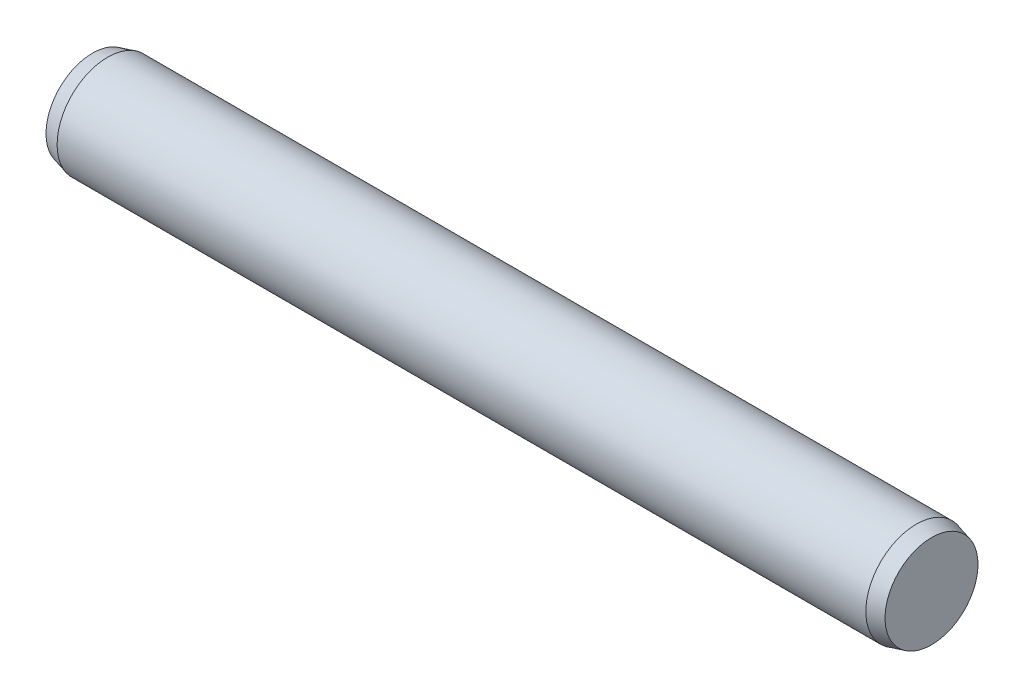
ISO-10303-21;
HEADER;
FILE_DESCRIPTION(('STEP AP214'),'2;1');
FILE_NAME('part.step','',(''),(''),'','','');
FILE_SCHEMA(('AUTOMOTIVE_DESIGN { 1 0 10303 214 1 1 1 1 }'));
ENDSEC;
DATA;
#1=APPLICATION_CONTEXT('core data for automotive mechanical design processes');
#2=APPLICATION_PROTOCOL_DEFINITION('international standard','automotive_design',2000,#1);
#3=PRODUCT_CONTEXT('',#1,'mechanical');
#4=PRODUCT('Part','Part','',(#3));
#5=PRODUCT_RELATED_PRODUCT_CATEGORY('part','',(#4));
#6=PRODUCT_DEFINITION_FORMATION('','',#4);
#7=PRODUCT_DEFINITION_CONTEXT('part definition',#1,'design');
#8=PRODUCT_DEFINITION('design','',#6,#7);
#9=PRODUCT_DEFINITION_SHAPE('','',#8);
#10=(LENGTH_UNIT() NAMED_UNIT(*) SI_UNIT(.MILLI.,.METRE.));
#11=(NAMED_UNIT(*) PLANE_ANGLE_UNIT() SI_UNIT($,.RADIAN.));
#12=(NAMED_UNIT(*) SI_UNIT($,.STERADIAN.) SOLID_ANGLE_UNIT());
#13=UNCERTAINTY_MEASURE_WITH_UNIT(LENGTH_MEASURE(1.E-05),#10,'distance_accuracy_value','');
#14=(GEOMETRIC_REPRESENTATION_CONTEXT(3) GLOBAL_UNCERTAINTY_ASSIGNED_CONTEXT((#13)) GLOBAL_UNIT_ASSIGNED_CONTEXT((#10,
#11,#12)) REPRESENTATION_CONTEXT('',''));
#15=CARTESIAN_POINT('',(0.,0.,0.));
#16=DIRECTION('',(0.,0.,1.));
#17=DIRECTION('',(1.,0.,0.));
#18=AXIS2_PLACEMENT_3D('',#15,#16,#17);
#19=CARTESIAN_POINT('',(-12.,0.,0.));
#20=DIRECTION('',(1.,0.,0.));
#21=DIRECTION('',(0.,0.,-1.));
#22=AXIS2_PLACEMENT_3D('',#19,#20,#21);
#23=CYLINDRICAL_SURFACE('',#22,1.5);
#24=CARTESIAN_POINT('',(-12.,0.,0.));
#25=DIRECTION('',(-1.,0.,0.));
#26=DIRECTION('',(0.,0.,1.));
#27=AXIS2_PLACEMENT_3D('',#24,#25,#26);
#28=CIRCLE('',#27,1.5);
#29=CARTESIAN_POINT('',(-12.,0.,1.5));
#30=VERTEX_POINT('',#29);
#31=EDGE_CURVE('E44',#30,#30,#28,.T.);
#32=ORIENTED_EDGE('',*,*,#31,.F.);
#33=EDGE_LOOP('',(#32));
#34=FACE_BOUND('',#33,.T.);
#35=CARTESIAN_POINT('',(12.,0.,0.));
#36=DIRECTION('',(1.,0.,0.));
#37=DIRECTION('',(0.,0.,-1.));
#38=AXIS2_PLACEMENT_3D('',#35,#36,#37);
#39=CIRCLE('',#38,1.5);
#40=CARTESIAN_POINT('',(12.,0.,-1.5));
#41=VERTEX_POINT('',#40);
#42=EDGE_CURVE('E10',#41,#41,#39,.T.);
#43=ORIENTED_EDGE('',*,*,#42,.F.);
#44=EDGE_LOOP('',(#43));
#45=FACE_BOUND('',#44,.T.);
#46=ADVANCED_FACE('F30',(#34,#45),#23,.T.);
#47=CARTESIAN_POINT('',(12.,0.,0.));
#48=DIRECTION('',(-1.,0.,0.));
#49=DIRECTION('',(0.,0.,-1.));
#50=AXIS2_PLACEMENT_3D('',#47,#48,#49);
#51=CONICAL_SURFACE('',#50,1.5,0.26179938779915);
#52=CARTESIAN_POINT('',(12.45,0.,0.));
#53=DIRECTION('',(1.,0.,0.));
#54=DIRECTION('',(0.,0.,-1.));
#55=AXIS2_PLACEMENT_3D('',#52,#53,#54);
#56=CIRCLE('',#55,1.379422863406);
#57=CARTESIAN_POINT('',(12.45,0.,-1.379422863406));
#58=VERTEX_POINT('',#57);
#59=EDGE_CURVE('E36',#58,#58,#56,.T.);
#60=ORIENTED_EDGE('',*,*,#59,.F.);
#61=EDGE_LOOP('',(#60));
#62=FACE_BOUND('',#61,.T.);
#63=ORIENTED_EDGE('',*,*,#42,.T.);
#64=EDGE_LOOP('',(#63));
#65=FACE_BOUND('',#64,.T.);
#66=ADVANCED_FACE('F54',(#62,#65),#51,.T.);
#67=CARTESIAN_POINT('',(12.45,0.,0.));
#68=DIRECTION('',(1.,0.,0.));
#69=DIRECTION('',(0.,0.,-1.));
#70=AXIS2_PLACEMENT_3D('',#67,#68,#69);
#71=PLANE('',#70);
#72=ORIENTED_EDGE('',*,*,#59,.T.);
#73=EDGE_LOOP('',(#72));
#74=FACE_BOUND('',#73,.T.);
#75=ADVANCED_FACE('F58',(#74),#71,.T.);
#76=CARTESIAN_POINT('',(-12.,0.,0.));
#77=DIRECTION('',(1.,0.,0.));
#78=DIRECTION('',(0.,0.,1.));
#79=AXIS2_PLACEMENT_3D('',#76,#77,#78);
#80=CONICAL_SURFACE('',#79,1.5,0.26179938779915);
#81=CARTESIAN_POINT('',(-12.45,0.,0.));
#82=DIRECTION('',(-1.,0.,0.));
#83=DIRECTION('',(0.,0.,1.));
#84=AXIS2_PLACEMENT_3D('',#81,#82,#83);
#85=CIRCLE('',#84,1.379422863406);
#86=CARTESIAN_POINT('',(-12.45,0.,1.379422863406));
#87=VERTEX_POINT('',#86);
#88=EDGE_CURVE('E40',#87,#87,#85,.T.);
#89=ORIENTED_EDGE('',*,*,#88,.F.);
#90=EDGE_LOOP('',(#89));
#91=FACE_BOUND('',#90,.T.);
#92=ORIENTED_EDGE('',*,*,#31,.T.);
#93=EDGE_LOOP('',(#92));
#94=FACE_BOUND('',#93,.T.);
#95=ADVANCED_FACE('F50',(#91,#94),#80,.T.);
#96=CARTESIAN_POINT('',(-12.45,0.,0.));
#97=DIRECTION('',(-1.,0.,0.));
#98=DIRECTION('',(0.,0.,1.));
#99=AXIS2_PLACEMENT_3D('',#96,#97,#98);
#100=PLANE('',#99);
#101=ORIENTED_EDGE('',*,*,#88,.T.);
#102=EDGE_LOOP('',(#101));
#103=FACE_BOUND('',#102,.T.);
#104=ADVANCED_FACE('F67',(#103),#100,.T.);
#105=CLOSED_SHELL('',(#46,#66,#75,#95,#104));
#106=MANIFOLD_SOLID_BREP('B2',#105);
#107=ADVANCED_BREP_SHAPE_REPRESENTATION('',(#18,#106),#14);
#108=SHAPE_DEFINITION_REPRESENTATION(#9,#107);
ENDSEC;
END-ISO-10303-21;
